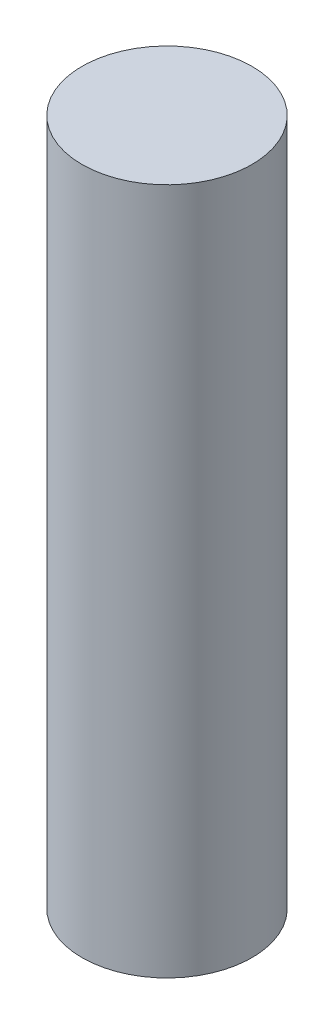
ISO-10303-21;
HEADER;
FILE_DESCRIPTION(('STEP AP214'),'2;1');
FILE_NAME('part.step','',(''),(''),'','','');
FILE_SCHEMA(('AUTOMOTIVE_DESIGN { 1 0 10303 214 1 1 1 1 }'));
ENDSEC;
DATA;
#1=APPLICATION_CONTEXT('core data for automotive mechanical design processes');
#2=APPLICATION_PROTOCOL_DEFINITION('international standard','automotive_design',2000,#1);
#3=PRODUCT_CONTEXT('',#1,'mechanical');
#4=PRODUCT('Part','Part','',(#3));
#5=PRODUCT_RELATED_PRODUCT_CATEGORY('part','',(#4));
#6=PRODUCT_DEFINITION_FORMATION('','',#4);
#7=PRODUCT_DEFINITION_CONTEXT('part definition',#1,'design');
#8=PRODUCT_DEFINITION('design','',#6,#7);
#9=PRODUCT_DEFINITION_SHAPE('','',#8);
#10=(LENGTH_UNIT() NAMED_UNIT(*) SI_UNIT(.MILLI.,.METRE.));
#11=(NAMED_UNIT(*) PLANE_ANGLE_UNIT() SI_UNIT($,.RADIAN.));
#12=(NAMED_UNIT(*) SI_UNIT($,.STERADIAN.) SOLID_ANGLE_UNIT());
#13=UNCERTAINTY_MEASURE_WITH_UNIT(LENGTH_MEASURE(1.E-05),#10,'distance_accuracy_value','');
#14=(GEOMETRIC_REPRESENTATION_CONTEXT(3) GLOBAL_UNCERTAINTY_ASSIGNED_CONTEXT((#13)) GLOBAL_UNIT_ASSIGNED_CONTEXT((#10,
#11,#12)) REPRESENTATION_CONTEXT('',''));
#15=CARTESIAN_POINT('',(0.,0.,0.));
#16=DIRECTION('',(0.,0.,1.));
#17=DIRECTION('',(1.,0.,0.));
#18=AXIS2_PLACEMENT_3D('',#15,#16,#17);
#19=CARTESIAN_POINT('',(0.,20.2,0.));
#20=DIRECTION('',(0.,-1.,0.));
#21=DIRECTION('',(0.,0.,-1.));
#22=AXIS2_PLACEMENT_3D('',#19,#20,#21);
#23=CYLINDRICAL_SURFACE('',#22,2.5);
#24=CARTESIAN_POINT('',(0.,20.2,0.));
#25=DIRECTION('',(0.,1.,0.));
#26=DIRECTION('',(0.,0.,1.));
#27=AXIS2_PLACEMENT_3D('',#24,#25,#26);
#28=CIRCLE('',#27,2.5);
#29=CARTESIAN_POINT('',(0.,20.2,2.5));
#30=VERTEX_POINT('',#29);
#31=EDGE_CURVE('E10',#30,#30,#28,.T.);
#32=ORIENTED_EDGE('',*,*,#31,.F.);
#33=EDGE_LOOP('',(#32));
#34=FACE_BOUND('',#33,.T.);
#35=CARTESIAN_POINT('',(0.,0.,0.));
#36=DIRECTION('',(0.,1.,0.));
#37=DIRECTION('',(0.,0.,1.));
#38=AXIS2_PLACEMENT_3D('',#35,#36,#37);
#39=CIRCLE('',#38,2.5);
#40=CARTESIAN_POINT('',(0.,0.,2.5));
#41=VERTEX_POINT('',#40);
#42=EDGE_CURVE('E37',#41,#41,#39,.T.);
#43=ORIENTED_EDGE('',*,*,#42,.T.);
#44=EDGE_LOOP('',(#43));
#45=FACE_BOUND('',#44,.T.);
#46=ADVANCED_FACE('F34',(#34,#45),#23,.T.);
#47=CARTESIAN_POINT('',(0.,20.2,0.));
#48=DIRECTION('',(0.,1.,0.));
#49=DIRECTION('',(0.,0.,1.));
#50=AXIS2_PLACEMENT_3D('',#47,#48,#49);
#51=PLANE('',#50);
#52=ORIENTED_EDGE('',*,*,#31,.T.);
#53=EDGE_LOOP('',(#52));
#54=FACE_BOUND('',#53,.T.);
#55=ADVANCED_FACE('F49',(#54),#51,.T.);
#56=CARTESIAN_POINT('',(0.,0.,0.));
#57=DIRECTION('',(0.,1.,0.));
#58=DIRECTION('',(0.,0.,1.));
#59=AXIS2_PLACEMENT_3D('',#56,#57,#58);
#60=PLANE('',#59);
#61=ORIENTED_EDGE('',*,*,#42,.F.);
#62=EDGE_LOOP('',(#61));
#63=FACE_BOUND('',#62,.T.);
#64=ADVANCED_FACE('F47',(#63),#60,.F.);
#65=CLOSED_SHELL('',(#46,#55,#64));
#66=MANIFOLD_SOLID_BREP('B2',#65);
#67=ADVANCED_BREP_SHAPE_REPRESENTATION('',(#18,#66),#14);
#68=SHAPE_DEFINITION_REPRESENTATION(#9,#67);
ENDSEC;
END-ISO-10303-21;
